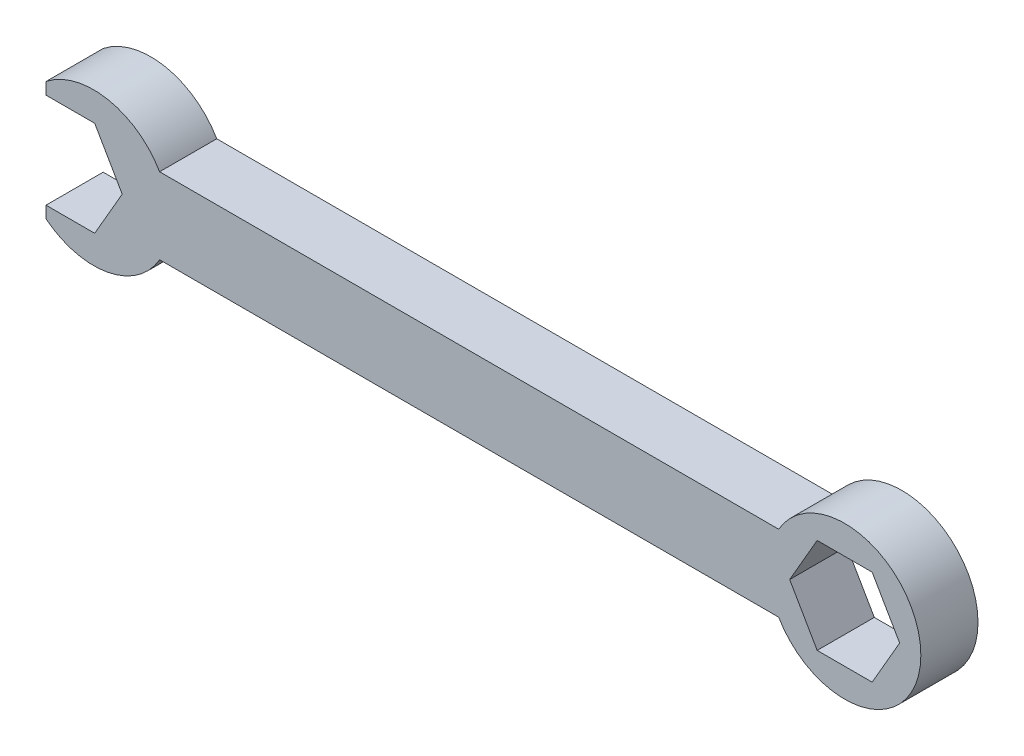
ISO-10303-21;
HEADER;
FILE_DESCRIPTION(('STEP AP214'),'2;1');
FILE_NAME('part.step','',(''),(''),'','','');
FILE_SCHEMA(('AUTOMOTIVE_DESIGN { 1 0 10303 214 1 1 1 1 }'));
ENDSEC;
DATA;
#1=APPLICATION_CONTEXT('core data for automotive mechanical design processes');
#2=APPLICATION_PROTOCOL_DEFINITION('international standard','automotive_design',2000,#1);
#3=PRODUCT_CONTEXT('',#1,'mechanical');
#4=PRODUCT('Part','Part','',(#3));
#5=PRODUCT_RELATED_PRODUCT_CATEGORY('part','',(#4));
#6=PRODUCT_DEFINITION_FORMATION('','',#4);
#7=PRODUCT_DEFINITION_CONTEXT('part definition',#1,'design');
#8=PRODUCT_DEFINITION('design','',#6,#7);
#9=PRODUCT_DEFINITION_SHAPE('','',#8);
#10=(LENGTH_UNIT() NAMED_UNIT(*) SI_UNIT(.MILLI.,.METRE.));
#11=(NAMED_UNIT(*) PLANE_ANGLE_UNIT() SI_UNIT($,.RADIAN.));
#12=(NAMED_UNIT(*) SI_UNIT($,.STERADIAN.) SOLID_ANGLE_UNIT());
#13=UNCERTAINTY_MEASURE_WITH_UNIT(LENGTH_MEASURE(1.E-05),#10,'distance_accuracy_value','');
#14=(GEOMETRIC_REPRESENTATION_CONTEXT(3) GLOBAL_UNCERTAINTY_ASSIGNED_CONTEXT((#13)) GLOBAL_UNIT_ASSIGNED_CONTEXT((#10,
#11,#12)) REPRESENTATION_CONTEXT('',''));
#15=CARTESIAN_POINT('',(0.,0.,0.));
#16=DIRECTION('',(0.,0.,1.));
#17=DIRECTION('',(1.,0.,0.));
#18=AXIS2_PLACEMENT_3D('',#15,#16,#17);
#19=CARTESIAN_POINT('',(-3.81,0.,7.62));
#20=DIRECTION('',(0.,0.,1.));
#21=DIRECTION('',(1.,0.,0.));
#22=AXIS2_PLACEMENT_3D('',#19,#20,#21);
#23=PLANE('',#22);
#24=DIRECTION('',(-0.499999999999996,-0.866025403784441,0.));
#25=VECTOR('',#24,1.);
#26=CARTESIAN_POINT('',(-3.66617420935408,-6.35,7.62));
#27=LINE('',#26,#25);
#28=CARTESIAN_POINT('',(0.,0.,7.62));
#29=VERTEX_POINT('',#28);
#30=CARTESIAN_POINT('',(-3.66617420935408,-6.35,7.62));
#31=VERTEX_POINT('',#30);
#32=EDGE_CURVE('E202',#29,#31,#27,.T.);
#33=ORIENTED_EDGE('',*,*,#32,.T.);
#34=DIRECTION('',(-1.,0.,0.));
#35=VECTOR('',#34,1.);
#36=CARTESIAN_POINT('',(-10.16,-6.35000000000003,7.62));
#37=LINE('',#36,#35);
#38=CARTESIAN_POINT('',(-10.16,-6.35000000000003,7.62));
#39=VERTEX_POINT('',#38);
#40=EDGE_CURVE('E205',#31,#39,#37,.T.);
#41=ORIENTED_EDGE('',*,*,#40,.T.);
#42=DIRECTION('',(0.,-1.,0.));
#43=VECTOR('',#42,1.);
#44=CARTESIAN_POINT('',(-10.16,-7.93114745796598,7.62));
#45=LINE('',#44,#43);
#46=CARTESIAN_POINT('',(-10.16,-7.93114745796598,7.62));
#47=VERTEX_POINT('',#46);
#48=EDGE_CURVE('E208',#39,#47,#45,.T.);
#49=ORIENTED_EDGE('',*,*,#48,.T.);
#50=CARTESIAN_POINT('',(-3.81,0.,7.62));
#51=DIRECTION('',(0.,0.,1.));
#52=DIRECTION('',(-1.,0.,0.));
#53=AXIS2_PLACEMENT_3D('',#50,#51,#52);
#54=CIRCLE('',#53,10.16);
#55=CARTESIAN_POINT('',(4.9888181024499,-5.08000000000001,7.62));
#56=VERTEX_POINT('',#55);
#57=EDGE_CURVE('E210',#47,#56,#54,.T.);
#58=ORIENTED_EDGE('',*,*,#57,.T.);
#59=DIRECTION('',(1.,0.,0.));
#60=VECTOR('',#59,1.);
#61=CARTESIAN_POINT('',(4.9888181024499,-5.08000000000001,7.62));
#62=LINE('',#61,#60);
#63=CARTESIAN_POINT('',(87.5388181024499,-5.07999999999998,7.62));
#64=VERTEX_POINT('',#63);
#65=EDGE_CURVE('E212',#56,#64,#62,.T.);
#66=ORIENTED_EDGE('',*,*,#65,.T.);
#67=CARTESIAN_POINT('',(96.3376362048998,0.,7.62));
#68=DIRECTION('',(0.,0.,1.));
#69=DIRECTION('',(-1.,0.,0.));
#70=AXIS2_PLACEMENT_3D('',#67,#68,#69);
#71=CIRCLE('',#70,10.16);
#72=CARTESIAN_POINT('',(87.5388181024499,5.07999999999999,7.62));
#73=VERTEX_POINT('',#72);
#74=EDGE_CURVE('E214',#64,#73,#71,.T.);
#75=ORIENTED_EDGE('',*,*,#74,.T.);
#76=DIRECTION('',(-1.,0.,0.));
#77=VECTOR('',#76,1.);
#78=CARTESIAN_POINT('',(4.9888181024499,5.07999999999999,7.62));
#79=LINE('',#78,#77);
#80=CARTESIAN_POINT('',(4.9888181024499,5.07999999999999,7.62));
#81=VERTEX_POINT('',#80);
#82=EDGE_CURVE('E216',#73,#81,#79,.T.);
#83=ORIENTED_EDGE('',*,*,#82,.T.);
#84=CARTESIAN_POINT('',(-3.81,0.,7.62));
#85=DIRECTION('',(0.,0.,1.));
#86=DIRECTION('',(1.,0.,0.));
#87=AXIS2_PLACEMENT_3D('',#84,#85,#86);
#88=CIRCLE('',#87,10.16);
#89=CARTESIAN_POINT('',(-10.16,7.93114745796595,7.62));
#90=VERTEX_POINT('',#89);
#91=EDGE_CURVE('E218',#81,#90,#88,.T.);
#92=ORIENTED_EDGE('',*,*,#91,.T.);
#93=DIRECTION('',(0.,-1.,0.));
#94=VECTOR('',#93,1.);
#95=CARTESIAN_POINT('',(-10.16,7.93114745796595,7.62));
#96=LINE('',#95,#94);
#97=CARTESIAN_POINT('',(-10.16,6.35,7.62));
#98=VERTEX_POINT('',#97);
#99=EDGE_CURVE('E220',#90,#98,#96,.T.);
#100=ORIENTED_EDGE('',*,*,#99,.T.);
#101=DIRECTION('',(1.,0.,0.));
#102=VECTOR('',#101,1.);
#103=CARTESIAN_POINT('',(-10.16,6.35,7.62));
#104=LINE('',#103,#102);
#105=CARTESIAN_POINT('',(-3.66617420935408,6.35000000000001,7.62));
#106=VERTEX_POINT('',#105);
#107=EDGE_CURVE('E222',#98,#106,#104,.T.);
#108=ORIENTED_EDGE('',*,*,#107,.T.);
#109=DIRECTION('',(0.499999999999996,-0.866025403784441,0.));
#110=VECTOR('',#109,1.);
#111=CARTESIAN_POINT('',(-3.66617420935408,6.35000000000001,7.62));
#112=LINE('',#111,#110);
#113=EDGE_CURVE('E224',#106,#29,#112,.T.);
#114=ORIENTED_EDGE('',*,*,#113,.T.);
#115=EDGE_LOOP('',(#33,#41,#49,#58,#66,#75,#83,#92,#100,#108,#114));
#116=FACE_BOUND('',#115,.T.);
#117=DIRECTION('',(0.500000000000001,-0.866025403784438,0.));
#118=VECTOR('',#117,1.);
#119=CARTESIAN_POINT('',(92.6714619955457,-6.35,7.62));
#120=LINE('',#119,#118);
#121=CARTESIAN_POINT('',(89.0052877861915,0.,7.62));
#122=VERTEX_POINT('',#121);
#123=CARTESIAN_POINT('',(92.6714619955457,-6.35,7.62));
#124=VERTEX_POINT('',#123);
#125=EDGE_CURVE('E159',#122,#124,#120,.T.);
#126=ORIENTED_EDGE('',*,*,#125,.F.);
#127=DIRECTION('',(-0.499999999999999,-0.86602540378444,0.));
#128=VECTOR('',#127,1.);
#129=CARTESIAN_POINT('',(89.0052877861915,0.,7.62));
#130=LINE('',#129,#128);
#131=CARTESIAN_POINT('',(92.6714619955457,6.35000000000003,7.62));
#132=VERTEX_POINT('',#131);
#133=EDGE_CURVE('E151',#132,#122,#130,.T.);
#134=ORIENTED_EDGE('',*,*,#133,.F.);
#135=DIRECTION('',(-1.,0.,0.));
#136=VECTOR('',#135,1.);
#137=CARTESIAN_POINT('',(92.6714619955457,6.35000000000003,7.62));
#138=LINE('',#137,#136);
#139=CARTESIAN_POINT('',(100.003810414254,6.35000000000003,7.62));
#140=VERTEX_POINT('',#139);
#141=EDGE_CURVE('E180',#140,#132,#138,.T.);
#142=ORIENTED_EDGE('',*,*,#141,.F.);
#143=DIRECTION('',(-0.5,0.866025403784439,0.));
#144=VECTOR('',#143,1.);
#145=CARTESIAN_POINT('',(100.003810414254,6.35000000000003,7.62));
#146=LINE('',#145,#144);
#147=CARTESIAN_POINT('',(103.669984623608,0.,7.62));
#148=VERTEX_POINT('',#147);
#149=EDGE_CURVE('E178',#148,#140,#146,.T.);
#150=ORIENTED_EDGE('',*,*,#149,.F.);
#151=DIRECTION('',(0.499999999999994,0.866025403784442,0.));
#152=VECTOR('',#151,1.);
#153=CARTESIAN_POINT('',(103.669984623608,0.,7.62));
#154=LINE('',#153,#152);
#155=CARTESIAN_POINT('',(100.003810414254,-6.35000000000003,7.62));
#156=VERTEX_POINT('',#155);
#157=EDGE_CURVE('E174',#156,#148,#154,.T.);
#158=ORIENTED_EDGE('',*,*,#157,.F.);
#159=DIRECTION('',(1.,0.,0.));
#160=VECTOR('',#159,1.);
#161=CARTESIAN_POINT('',(100.003810414254,-6.35000000000003,7.62));
#162=LINE('',#161,#160);
#163=EDGE_CURVE('E172',#124,#156,#162,.T.);
#164=ORIENTED_EDGE('',*,*,#163,.F.);
#165=EDGE_LOOP('',(#126,#134,#142,#150,#158,#164));
#166=FACE_BOUND('',#165,.T.);
#167=ADVANCED_FACE('F32',(#116,#166),#23,.T.);
#168=CARTESIAN_POINT('',(-3.81,0.,0.));
#169=DIRECTION('',(0.,0.,1.));
#170=DIRECTION('',(1.,0.,0.));
#171=AXIS2_PLACEMENT_3D('',#168,#169,#170);
#172=PLANE('',#171);
#173=DIRECTION('',(-0.499999999999996,-0.866025403784441,0.));
#174=VECTOR('',#173,1.);
#175=CARTESIAN_POINT('',(-3.66617420935408,-6.35,0.));
#176=LINE('',#175,#174);
#177=CARTESIAN_POINT('',(0.,0.,0.));
#178=VERTEX_POINT('',#177);
#179=CARTESIAN_POINT('',(-3.66617420935408,-6.35,0.));
#180=VERTEX_POINT('',#179);
#181=EDGE_CURVE('E167',#178,#180,#176,.T.);
#182=ORIENTED_EDGE('',*,*,#181,.F.);
#183=DIRECTION('',(0.499999999999996,-0.866025403784441,0.));
#184=VECTOR('',#183,1.);
#185=CARTESIAN_POINT('',(-3.66617420935408,6.35000000000001,0.));
#186=LINE('',#185,#184);
#187=CARTESIAN_POINT('',(-3.66617420935408,6.35000000000001,0.));
#188=VERTEX_POINT('',#187);
#189=EDGE_CURVE('E206',#188,#178,#186,.T.);
#190=ORIENTED_EDGE('',*,*,#189,.F.);
#191=DIRECTION('',(1.,0.,0.));
#192=VECTOR('',#191,1.);
#193=CARTESIAN_POINT('',(-10.16,6.35,0.));
#194=LINE('',#193,#192);
#195=CARTESIAN_POINT('',(-10.16,6.35,0.));
#196=VERTEX_POINT('',#195);
#197=EDGE_CURVE('E245',#196,#188,#194,.T.);
#198=ORIENTED_EDGE('',*,*,#197,.F.);
#199=DIRECTION('',(0.,-1.,0.));
#200=VECTOR('',#199,1.);
#201=CARTESIAN_POINT('',(-10.16,7.93114745796595,0.));
#202=LINE('',#201,#200);
#203=CARTESIAN_POINT('',(-10.16,7.93114745796595,0.));
#204=VERTEX_POINT('',#203);
#205=EDGE_CURVE('E243',#204,#196,#202,.T.);
#206=ORIENTED_EDGE('',*,*,#205,.F.);
#207=CARTESIAN_POINT('',(-3.81,0.,0.));
#208=DIRECTION('',(0.,0.,1.));
#209=DIRECTION('',(1.,0.,0.));
#210=AXIS2_PLACEMENT_3D('',#207,#208,#209);
#211=CIRCLE('',#210,10.16);
#212=CARTESIAN_POINT('',(4.9888181024499,5.07999999999999,0.));
#213=VERTEX_POINT('',#212);
#214=EDGE_CURVE('E241',#213,#204,#211,.T.);
#215=ORIENTED_EDGE('',*,*,#214,.F.);
#216=DIRECTION('',(-1.,0.,0.));
#217=VECTOR('',#216,1.);
#218=CARTESIAN_POINT('',(4.9888181024499,5.07999999999999,0.));
#219=LINE('',#218,#217);
#220=CARTESIAN_POINT('',(87.5388181024499,5.07999999999999,0.));
#221=VERTEX_POINT('',#220);
#222=EDGE_CURVE('E239',#221,#213,#219,.T.);
#223=ORIENTED_EDGE('',*,*,#222,.F.);
#224=CARTESIAN_POINT('',(96.3376362048998,0.,0.));
#225=DIRECTION('',(0.,0.,1.));
#226=DIRECTION('',(-1.,0.,0.));
#227=AXIS2_PLACEMENT_3D('',#224,#225,#226);
#228=CIRCLE('',#227,10.16);
#229=CARTESIAN_POINT('',(87.5388181024499,-5.07999999999998,0.));
#230=VERTEX_POINT('',#229);
#231=EDGE_CURVE('E237',#230,#221,#228,.T.);
#232=ORIENTED_EDGE('',*,*,#231,.F.);
#233=DIRECTION('',(1.,0.,0.));
#234=VECTOR('',#233,1.);
#235=CARTESIAN_POINT('',(4.9888181024499,-5.08000000000001,0.));
#236=LINE('',#235,#234);
#237=CARTESIAN_POINT('',(4.9888181024499,-5.08000000000001,0.));
#238=VERTEX_POINT('',#237);
#239=EDGE_CURVE('E235',#238,#230,#236,.T.);
#240=ORIENTED_EDGE('',*,*,#239,.F.);
#241=CARTESIAN_POINT('',(-3.81,0.,0.));
#242=DIRECTION('',(0.,0.,1.));
#243=DIRECTION('',(-1.,0.,0.));
#244=AXIS2_PLACEMENT_3D('',#241,#242,#243);
#245=CIRCLE('',#244,10.16);
#246=CARTESIAN_POINT('',(-10.16,-7.93114745796598,0.));
#247=VERTEX_POINT('',#246);
#248=EDGE_CURVE('E233',#247,#238,#245,.T.);
#249=ORIENTED_EDGE('',*,*,#248,.F.);
#250=DIRECTION('',(0.,-1.,0.));
#251=VECTOR('',#250,1.);
#252=CARTESIAN_POINT('',(-10.16,-7.93114745796598,0.));
#253=LINE('',#252,#251);
#254=CARTESIAN_POINT('',(-10.16,-6.35000000000003,0.));
#255=VERTEX_POINT('',#254);
#256=EDGE_CURVE('E231',#255,#247,#253,.T.);
#257=ORIENTED_EDGE('',*,*,#256,.F.);
#258=DIRECTION('',(-1.,0.,0.));
#259=VECTOR('',#258,1.);
#260=CARTESIAN_POINT('',(-10.16,-6.35000000000003,0.));
#261=LINE('',#260,#259);
#262=EDGE_CURVE('E229',#180,#255,#261,.T.);
#263=ORIENTED_EDGE('',*,*,#262,.F.);
#264=EDGE_LOOP('',(#182,#190,#198,#206,#215,#223,#232,#240,#249,#257,#263));
#265=FACE_BOUND('',#264,.T.);
#266=DIRECTION('',(-0.499999999999999,-0.86602540378444,0.));
#267=VECTOR('',#266,1.);
#268=CARTESIAN_POINT('',(89.0052877861915,0.,0.));
#269=LINE('',#268,#267);
#270=CARTESIAN_POINT('',(92.6714619955457,6.35000000000003,0.));
#271=VERTEX_POINT('',#270);
#272=CARTESIAN_POINT('',(89.0052877861915,0.,0.));
#273=VERTEX_POINT('',#272);
#274=EDGE_CURVE('E55',#271,#273,#269,.T.);
#275=ORIENTED_EDGE('',*,*,#274,.T.);
#276=DIRECTION('',(0.500000000000001,-0.866025403784438,0.));
#277=VECTOR('',#276,1.);
#278=CARTESIAN_POINT('',(92.6714619955457,-6.35,0.));
#279=LINE('',#278,#277);
#280=CARTESIAN_POINT('',(92.6714619955457,-6.35,0.));
#281=VERTEX_POINT('',#280);
#282=EDGE_CURVE('E166',#273,#281,#279,.T.);
#283=ORIENTED_EDGE('',*,*,#282,.T.);
#284=DIRECTION('',(1.,0.,0.));
#285=VECTOR('',#284,1.);
#286=CARTESIAN_POINT('',(100.003810414254,-6.35000000000003,0.));
#287=LINE('',#286,#285);
#288=CARTESIAN_POINT('',(100.003810414254,-6.35000000000003,0.));
#289=VERTEX_POINT('',#288);
#290=EDGE_CURVE('E184',#281,#289,#287,.T.);
#291=ORIENTED_EDGE('',*,*,#290,.T.);
#292=DIRECTION('',(0.499999999999994,0.866025403784442,0.));
#293=VECTOR('',#292,1.);
#294=CARTESIAN_POINT('',(103.669984623608,0.,0.));
#295=LINE('',#294,#293);
#296=CARTESIAN_POINT('',(103.669984623608,0.,0.));
#297=VERTEX_POINT('',#296);
#298=EDGE_CURVE('E187',#289,#297,#295,.T.);
#299=ORIENTED_EDGE('',*,*,#298,.T.);
#300=DIRECTION('',(-0.5,0.866025403784439,0.));
#301=VECTOR('',#300,1.);
#302=CARTESIAN_POINT('',(100.003810414254,6.35000000000003,0.));
#303=LINE('',#302,#301);
#304=CARTESIAN_POINT('',(100.003810414254,6.35000000000003,0.));
#305=VERTEX_POINT('',#304);
#306=EDGE_CURVE('E190',#297,#305,#303,.T.);
#307=ORIENTED_EDGE('',*,*,#306,.T.);
#308=DIRECTION('',(-1.,0.,0.));
#309=VECTOR('',#308,1.);
#310=CARTESIAN_POINT('',(92.6714619955457,6.35000000000003,0.));
#311=LINE('',#310,#309);
#312=EDGE_CURVE('E160',#305,#271,#311,.T.);
#313=ORIENTED_EDGE('',*,*,#312,.T.);
#314=EDGE_LOOP('',(#275,#283,#291,#299,#307,#313));
#315=FACE_BOUND('',#314,.T.);
#316=ADVANCED_FACE('F284',(#265,#315),#172,.F.);
#317=CARTESIAN_POINT('',(-3.66617420935408,-6.35,7.62));
#318=DIRECTION('',(0.866025403784441,-0.499999999999996,0.));
#319=DIRECTION('',(0.499999999999996,0.866025403784441,0.));
#320=AXIS2_PLACEMENT_3D('',#317,#318,#319);
#321=PLANE('',#320);
#322=ORIENTED_EDGE('',*,*,#181,.T.);
#323=DIRECTION('',(0.,0.,-1.));
#324=VECTOR('',#323,1.);
#325=CARTESIAN_POINT('',(-3.66617420935408,-6.35,7.62));
#326=LINE('',#325,#324);
#327=EDGE_CURVE('E11',#31,#180,#326,.T.);
#328=ORIENTED_EDGE('',*,*,#327,.F.);
#329=ORIENTED_EDGE('',*,*,#32,.F.);
#330=DIRECTION('',(0.,0.,-1.));
#331=VECTOR('',#330,1.);
#332=CARTESIAN_POINT('',(0.,0.,7.62));
#333=LINE('',#332,#331);
#334=EDGE_CURVE('E226',#29,#178,#333,.T.);
#335=ORIENTED_EDGE('',*,*,#334,.T.);
#336=EDGE_LOOP('',(#322,#328,#329,#335));
#337=FACE_BOUND('',#336,.T.);
#338=ADVANCED_FACE('F34',(#337),#321,.F.);
#339=CARTESIAN_POINT('',(-10.16,-6.35000000000003,7.62));
#340=DIRECTION('',(0.,-1.,0.));
#341=DIRECTION('',(1.,0.,0.));
#342=AXIS2_PLACEMENT_3D('',#339,#340,#341);
#343=PLANE('',#342);
#344=ORIENTED_EDGE('',*,*,#262,.T.);
#345=DIRECTION('',(0.,0.,-1.));
#346=VECTOR('',#345,1.);
#347=CARTESIAN_POINT('',(-10.16,-6.35000000000003,7.62));
#348=LINE('',#347,#346);
#349=EDGE_CURVE('E40',#39,#255,#348,.T.);
#350=ORIENTED_EDGE('',*,*,#349,.F.);
#351=ORIENTED_EDGE('',*,*,#40,.F.);
#352=ORIENTED_EDGE('',*,*,#327,.T.);
#353=EDGE_LOOP('',(#344,#350,#351,#352));
#354=FACE_BOUND('',#353,.T.);
#355=ADVANCED_FACE('F301',(#354),#343,.F.);
#356=CARTESIAN_POINT('',(-10.16,-7.93114745796598,7.62));
#357=DIRECTION('',(1.,0.,0.));
#358=DIRECTION('',(0.,0.,-1.));
#359=AXIS2_PLACEMENT_3D('',#356,#357,#358);
#360=PLANE('',#359);
#361=ORIENTED_EDGE('',*,*,#256,.T.);
#362=DIRECTION('',(0.,0.,-1.));
#363=VECTOR('',#362,1.);
#364=CARTESIAN_POINT('',(-10.16,-7.93114745796598,7.62));
#365=LINE('',#364,#363);
#366=EDGE_CURVE('E271',#47,#247,#365,.T.);
#367=ORIENTED_EDGE('',*,*,#366,.F.);
#368=ORIENTED_EDGE('',*,*,#48,.F.);
#369=ORIENTED_EDGE('',*,*,#349,.T.);
#370=EDGE_LOOP('',(#361,#367,#368,#369));
#371=FACE_BOUND('',#370,.T.);
#372=ADVANCED_FACE('F278',(#371),#360,.F.);
#373=CARTESIAN_POINT('',(-3.81,0.,7.62));
#374=DIRECTION('',(0.,0.,-1.));
#375=DIRECTION('',(-1.,0.,0.));
#376=AXIS2_PLACEMENT_3D('',#373,#374,#375);
#377=CYLINDRICAL_SURFACE('',#376,10.16);
#378=ORIENTED_EDGE('',*,*,#248,.T.);
#379=DIRECTION('',(0.,0.,-1.));
#380=VECTOR('',#379,1.);
#381=CARTESIAN_POINT('',(4.9888181024499,-5.08000000000001,7.62));
#382=LINE('',#381,#380);
#383=EDGE_CURVE('E268',#56,#238,#382,.T.);
#384=ORIENTED_EDGE('',*,*,#383,.F.);
#385=ORIENTED_EDGE('',*,*,#57,.F.);
#386=ORIENTED_EDGE('',*,*,#366,.T.);
#387=EDGE_LOOP('',(#378,#384,#385,#386));
#388=FACE_BOUND('',#387,.T.);
#389=ADVANCED_FACE('F290',(#388),#377,.T.);
#390=CARTESIAN_POINT('',(4.9888181024499,-5.08000000000001,7.62));
#391=DIRECTION('',(0.,1.,0.));
#392=DIRECTION('',(-1.,0.,0.));
#393=AXIS2_PLACEMENT_3D('',#390,#391,#392);
#394=PLANE('',#393);
#395=ORIENTED_EDGE('',*,*,#239,.T.);
#396=DIRECTION('',(0.,0.,-1.));
#397=VECTOR('',#396,1.);
#398=CARTESIAN_POINT('',(87.5388181024499,-5.07999999999998,7.62));
#399=LINE('',#398,#397);
#400=EDGE_CURVE('E265',#64,#230,#399,.T.);
#401=ORIENTED_EDGE('',*,*,#400,.F.);
#402=ORIENTED_EDGE('',*,*,#65,.F.);
#403=ORIENTED_EDGE('',*,*,#383,.T.);
#404=EDGE_LOOP('',(#395,#401,#402,#403));
#405=FACE_BOUND('',#404,.T.);
#406=ADVANCED_FACE('F294',(#405),#394,.F.);
#407=CARTESIAN_POINT('',(96.3376362048998,0.,7.62));
#408=DIRECTION('',(0.,0.,-1.));
#409=DIRECTION('',(-1.,0.,0.));
#410=AXIS2_PLACEMENT_3D('',#407,#408,#409);
#411=CYLINDRICAL_SURFACE('',#410,10.16);
#412=ORIENTED_EDGE('',*,*,#231,.T.);
#413=DIRECTION('',(0.,0.,-1.));
#414=VECTOR('',#413,1.);
#415=CARTESIAN_POINT('',(87.5388181024499,5.07999999999999,7.62));
#416=LINE('',#415,#414);
#417=EDGE_CURVE('E262',#73,#221,#416,.T.);
#418=ORIENTED_EDGE('',*,*,#417,.F.);
#419=ORIENTED_EDGE('',*,*,#74,.F.);
#420=ORIENTED_EDGE('',*,*,#400,.T.);
#421=EDGE_LOOP('',(#412,#418,#419,#420));
#422=FACE_BOUND('',#421,.T.);
#423=ADVANCED_FACE('F329',(#422),#411,.T.);
#424=CARTESIAN_POINT('',(4.9888181024499,5.07999999999999,7.62));
#425=DIRECTION('',(0.,-1.,0.));
#426=DIRECTION('',(0.,0.,-1.));
#427=AXIS2_PLACEMENT_3D('',#424,#425,#426);
#428=PLANE('',#427);
#429=ORIENTED_EDGE('',*,*,#222,.T.);
#430=DIRECTION('',(0.,0.,-1.));
#431=VECTOR('',#430,1.);
#432=CARTESIAN_POINT('',(4.9888181024499,5.07999999999999,7.62));
#433=LINE('',#432,#431);
#434=EDGE_CURVE('E259',#81,#213,#433,.T.);
#435=ORIENTED_EDGE('',*,*,#434,.F.);
#436=ORIENTED_EDGE('',*,*,#82,.F.);
#437=ORIENTED_EDGE('',*,*,#417,.T.);
#438=EDGE_LOOP('',(#429,#435,#436,#437));
#439=FACE_BOUND('',#438,.T.);
#440=ADVANCED_FACE('F327',(#439),#428,.F.);
#441=CARTESIAN_POINT('',(-3.81,0.,7.62));
#442=DIRECTION('',(0.,0.,-1.));
#443=DIRECTION('',(-1.,0.,0.));
#444=AXIS2_PLACEMENT_3D('',#441,#442,#443);
#445=CYLINDRICAL_SURFACE('',#444,10.16);
#446=ORIENTED_EDGE('',*,*,#214,.T.);
#447=DIRECTION('',(0.,0.,-1.));
#448=VECTOR('',#447,1.);
#449=CARTESIAN_POINT('',(-10.16,7.93114745796595,7.62));
#450=LINE('',#449,#448);
#451=EDGE_CURVE('E256',#90,#204,#450,.T.);
#452=ORIENTED_EDGE('',*,*,#451,.F.);
#453=ORIENTED_EDGE('',*,*,#91,.F.);
#454=ORIENTED_EDGE('',*,*,#434,.T.);
#455=EDGE_LOOP('',(#446,#452,#453,#454));
#456=FACE_BOUND('',#455,.T.);
#457=ADVANCED_FACE('F322',(#456),#445,.T.);
#458=CARTESIAN_POINT('',(-10.16,7.93114745796595,7.62));
#459=DIRECTION('',(1.,0.,0.));
#460=DIRECTION('',(0.,0.,-1.));
#461=AXIS2_PLACEMENT_3D('',#458,#459,#460);
#462=PLANE('',#461);
#463=ORIENTED_EDGE('',*,*,#205,.T.);
#464=DIRECTION('',(0.,0.,-1.));
#465=VECTOR('',#464,1.);
#466=CARTESIAN_POINT('',(-10.16,6.35,7.62));
#467=LINE('',#466,#465);
#468=EDGE_CURVE('E253',#98,#196,#467,.T.);
#469=ORIENTED_EDGE('',*,*,#468,.F.);
#470=ORIENTED_EDGE('',*,*,#99,.F.);
#471=ORIENTED_EDGE('',*,*,#451,.T.);
#472=EDGE_LOOP('',(#463,#469,#470,#471));
#473=FACE_BOUND('',#472,.T.);
#474=ADVANCED_FACE('F317',(#473),#462,.F.);
#475=CARTESIAN_POINT('',(-10.16,6.35,7.62));
#476=DIRECTION('',(0.,1.,0.));
#477=DIRECTION('',(-1.,0.,0.));
#478=AXIS2_PLACEMENT_3D('',#475,#476,#477);
#479=PLANE('',#478);
#480=ORIENTED_EDGE('',*,*,#197,.T.);
#481=DIRECTION('',(0.,0.,-1.));
#482=VECTOR('',#481,1.);
#483=CARTESIAN_POINT('',(-3.66617420935408,6.35000000000001,7.62));
#484=LINE('',#483,#482);
#485=EDGE_CURVE('E250',#106,#188,#484,.T.);
#486=ORIENTED_EDGE('',*,*,#485,.F.);
#487=ORIENTED_EDGE('',*,*,#107,.F.);
#488=ORIENTED_EDGE('',*,*,#468,.T.);
#489=EDGE_LOOP('',(#480,#486,#487,#488));
#490=FACE_BOUND('',#489,.T.);
#491=ADVANCED_FACE('F313',(#490),#479,.F.);
#492=CARTESIAN_POINT('',(-3.66617420935408,6.35000000000001,7.62));
#493=DIRECTION('',(0.866025403784441,0.499999999999996,0.));
#494=DIRECTION('',(-0.499999999999996,0.866025403784441,0.));
#495=AXIS2_PLACEMENT_3D('',#492,#493,#494);
#496=PLANE('',#495);
#497=ORIENTED_EDGE('',*,*,#189,.T.);
#498=ORIENTED_EDGE('',*,*,#334,.F.);
#499=ORIENTED_EDGE('',*,*,#113,.F.);
#500=ORIENTED_EDGE('',*,*,#485,.T.);
#501=EDGE_LOOP('',(#497,#498,#499,#500));
#502=FACE_BOUND('',#501,.T.);
#503=ADVANCED_FACE('F308',(#502),#496,.F.);
#504=CARTESIAN_POINT('',(89.0052877861915,0.,7.62));
#505=DIRECTION('',(0.866025403784439,-0.499999999999999,0.));
#506=DIRECTION('',(0.499999999999999,0.866025403784439,0.));
#507=AXIS2_PLACEMENT_3D('',#504,#505,#506);
#508=PLANE('',#507);
#509=ORIENTED_EDGE('',*,*,#274,.F.);
#510=DIRECTION('',(0.,0.,-1.));
#511=VECTOR('',#510,1.);
#512=CARTESIAN_POINT('',(92.6714619955457,6.35000000000003,7.62));
#513=LINE('',#512,#511);
#514=EDGE_CURVE('E155',#132,#271,#513,.T.);
#515=ORIENTED_EDGE('',*,*,#514,.F.);
#516=ORIENTED_EDGE('',*,*,#133,.T.);
#517=DIRECTION('',(0.,0.,-1.));
#518=VECTOR('',#517,1.);
#519=CARTESIAN_POINT('',(89.0052877861915,0.,7.62));
#520=LINE('',#519,#518);
#521=EDGE_CURVE('E154',#122,#273,#520,.T.);
#522=ORIENTED_EDGE('',*,*,#521,.T.);
#523=EDGE_LOOP('',(#509,#515,#516,#522));
#524=FACE_BOUND('',#523,.T.);
#525=ADVANCED_FACE('F153',(#524),#508,.T.);
#526=CARTESIAN_POINT('',(92.6714619955457,-6.35,7.62));
#527=DIRECTION('',(0.866025403784438,0.500000000000001,0.));
#528=DIRECTION('',(-0.500000000000001,0.866025403784438,0.));
#529=AXIS2_PLACEMENT_3D('',#526,#527,#528);
#530=PLANE('',#529);
#531=ORIENTED_EDGE('',*,*,#282,.F.);
#532=ORIENTED_EDGE('',*,*,#521,.F.);
#533=ORIENTED_EDGE('',*,*,#125,.T.);
#534=DIRECTION('',(0.,0.,-1.));
#535=VECTOR('',#534,1.);
#536=CARTESIAN_POINT('',(92.6714619955457,-6.35,7.62));
#537=LINE('',#536,#535);
#538=EDGE_CURVE('E168',#124,#281,#537,.T.);
#539=ORIENTED_EDGE('',*,*,#538,.T.);
#540=EDGE_LOOP('',(#531,#532,#533,#539));
#541=FACE_BOUND('',#540,.T.);
#542=ADVANCED_FACE('F163',(#541),#530,.T.);
#543=CARTESIAN_POINT('',(100.003810414254,-6.35000000000003,7.62));
#544=DIRECTION('',(0.,1.,0.));
#545=DIRECTION('',(-1.,0.,0.));
#546=AXIS2_PLACEMENT_3D('',#543,#544,#545);
#547=PLANE('',#546);
#548=ORIENTED_EDGE('',*,*,#290,.F.);
#549=ORIENTED_EDGE('',*,*,#538,.F.);
#550=ORIENTED_EDGE('',*,*,#163,.T.);
#551=DIRECTION('',(0.,0.,-1.));
#552=VECTOR('',#551,1.);
#553=CARTESIAN_POINT('',(100.003810414254,-6.35000000000003,7.62));
#554=LINE('',#553,#552);
#555=EDGE_CURVE('E199',#156,#289,#554,.T.);
#556=ORIENTED_EDGE('',*,*,#555,.T.);
#557=EDGE_LOOP('',(#548,#549,#550,#556));
#558=FACE_BOUND('',#557,.T.);
#559=ADVANCED_FACE('F381',(#558),#547,.T.);
#560=CARTESIAN_POINT('',(103.669984623608,0.,7.62));
#561=DIRECTION('',(-0.866025403784442,0.499999999999994,0.));
#562=DIRECTION('',(-0.499999999999994,-0.866025403784442,0.));
#563=AXIS2_PLACEMENT_3D('',#560,#561,#562);
#564=PLANE('',#563);
#565=ORIENTED_EDGE('',*,*,#298,.F.);
#566=ORIENTED_EDGE('',*,*,#555,.F.);
#567=ORIENTED_EDGE('',*,*,#157,.T.);
#568=DIRECTION('',(0.,0.,-1.));
#569=VECTOR('',#568,1.);
#570=CARTESIAN_POINT('',(103.669984623608,0.,7.62));
#571=LINE('',#570,#569);
#572=EDGE_CURVE('E197',#148,#297,#571,.T.);
#573=ORIENTED_EDGE('',*,*,#572,.T.);
#574=EDGE_LOOP('',(#565,#566,#567,#573));
#575=FACE_BOUND('',#574,.T.);
#576=ADVANCED_FACE('F387',(#575),#564,.T.);
#577=CARTESIAN_POINT('',(100.003810414254,6.35000000000003,7.62));
#578=DIRECTION('',(-0.866025403784439,-0.5,0.));
#579=DIRECTION('',(0.5,-0.866025403784439,0.));
#580=AXIS2_PLACEMENT_3D('',#577,#578,#579);
#581=PLANE('',#580);
#582=ORIENTED_EDGE('',*,*,#306,.F.);
#583=ORIENTED_EDGE('',*,*,#572,.F.);
#584=ORIENTED_EDGE('',*,*,#149,.T.);
#585=DIRECTION('',(0.,0.,-1.));
#586=VECTOR('',#585,1.);
#587=CARTESIAN_POINT('',(100.003810414254,6.35000000000003,7.62));
#588=LINE('',#587,#586);
#589=EDGE_CURVE('E47',#140,#305,#588,.T.);
#590=ORIENTED_EDGE('',*,*,#589,.T.);
#591=EDGE_LOOP('',(#582,#583,#584,#590));
#592=FACE_BOUND('',#591,.T.);
#593=ADVANCED_FACE('F395',(#592),#581,.T.);
#594=CARTESIAN_POINT('',(92.6714619955457,6.35000000000003,7.62));
#595=DIRECTION('',(0.,-1.,0.));
#596=DIRECTION('',(0.,0.,-1.));
#597=AXIS2_PLACEMENT_3D('',#594,#595,#596);
#598=PLANE('',#597);
#599=ORIENTED_EDGE('',*,*,#312,.F.);
#600=ORIENTED_EDGE('',*,*,#589,.F.);
#601=ORIENTED_EDGE('',*,*,#141,.T.);
#602=ORIENTED_EDGE('',*,*,#514,.T.);
#603=EDGE_LOOP('',(#599,#600,#601,#602));
#604=FACE_BOUND('',#603,.T.);
#605=ADVANCED_FACE('F403',(#604),#598,.T.);
#606=CLOSED_SHELL('',(#167,#316,#338,#355,#372,#389,#406,#423,#440,#457,#474,#491,#503,#525,
#542,#559,#576,#593,#605));
#607=MANIFOLD_SOLID_BREP('B2',#606);
#608=ADVANCED_BREP_SHAPE_REPRESENTATION('',(#18,#607),#14);
#609=SHAPE_DEFINITION_REPRESENTATION(#9,#608);
ENDSEC;
END-ISO-10303-21;
